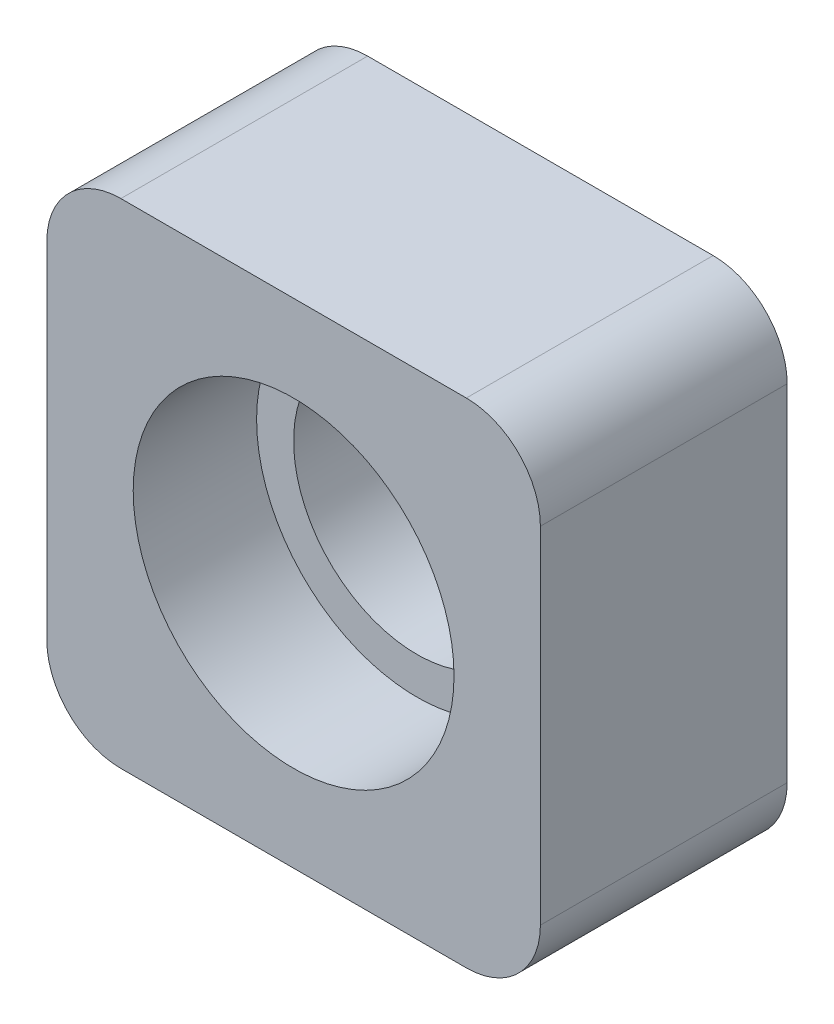
ISO-10303-21;
HEADER;
FILE_DESCRIPTION(('STEP AP214'),'2;1');
FILE_NAME('part.step','',(''),(''),'','','');
FILE_SCHEMA(('AUTOMOTIVE_DESIGN { 1 0 10303 214 1 1 1 1 }'));
ENDSEC;
DATA;
#1=APPLICATION_CONTEXT('core data for automotive mechanical design processes');
#2=APPLICATION_PROTOCOL_DEFINITION('international standard','automotive_design',2000,#1);
#3=PRODUCT_CONTEXT('',#1,'mechanical');
#4=PRODUCT('Part','Part','',(#3));
#5=PRODUCT_RELATED_PRODUCT_CATEGORY('part','',(#4));
#6=PRODUCT_DEFINITION_FORMATION('','',#4);
#7=PRODUCT_DEFINITION_CONTEXT('part definition',#1,'design');
#8=PRODUCT_DEFINITION('design','',#6,#7);
#9=PRODUCT_DEFINITION_SHAPE('','',#8);
#10=(LENGTH_UNIT() NAMED_UNIT(*) SI_UNIT(.MILLI.,.METRE.));
#11=(NAMED_UNIT(*) PLANE_ANGLE_UNIT() SI_UNIT($,.RADIAN.));
#12=(NAMED_UNIT(*) SI_UNIT($,.STERADIAN.) SOLID_ANGLE_UNIT());
#13=UNCERTAINTY_MEASURE_WITH_UNIT(LENGTH_MEASURE(1.E-05),#10,'distance_accuracy_value','');
#14=(GEOMETRIC_REPRESENTATION_CONTEXT(3) GLOBAL_UNCERTAINTY_ASSIGNED_CONTEXT((#13)) GLOBAL_UNIT_ASSIGNED_CONTEXT((#10,
#11,#12)) REPRESENTATION_CONTEXT('',''));
#15=CARTESIAN_POINT('',(0.,0.,0.));
#16=DIRECTION('',(0.,0.,1.));
#17=DIRECTION('',(1.,0.,0.));
#18=AXIS2_PLACEMENT_3D('',#15,#16,#17);
#19=CARTESIAN_POINT('',(0.,0.,-5.001));
#20=DIRECTION('',(0.,0.,1.));
#21=DIRECTION('',(1.,0.,0.));
#22=AXIS2_PLACEMENT_3D('',#19,#20,#21);
#23=CYLINDRICAL_SURFACE('',#22,5.);
#24=CARTESIAN_POINT('',(0.,0.,-5.));
#25=DIRECTION('',(0.,0.,-1.));
#26=DIRECTION('',(-1.,0.,0.));
#27=AXIS2_PLACEMENT_3D('',#24,#25,#26);
#28=CIRCLE('',#27,5.);
#29=CARTESIAN_POINT('',(-5.,0.,-5.));
#30=VERTEX_POINT('',#29);
#31=EDGE_CURVE('E208',#30,#30,#28,.F.);
#32=ORIENTED_EDGE('',*,*,#31,.F.);
#33=EDGE_LOOP('',(#32));
#34=FACE_BOUND('',#33,.T.);
#35=CARTESIAN_POINT('',(0.,0.,0.));
#36=DIRECTION('',(0.,0.,1.));
#37=DIRECTION('',(1.,0.,0.));
#38=AXIS2_PLACEMENT_3D('',#35,#36,#37);
#39=CIRCLE('',#38,5.);
#40=CARTESIAN_POINT('',(5.,0.,0.));
#41=VERTEX_POINT('',#40);
#42=EDGE_CURVE('E60',#41,#41,#39,.F.);
#43=ORIENTED_EDGE('',*,*,#42,.F.);
#44=EDGE_LOOP('',(#43));
#45=FACE_BOUND('',#44,.T.);
#46=ADVANCED_FACE('F56',(#34,#45),#23,.F.);
#47=CARTESIAN_POINT('',(10.,-10.,5.));
#48=DIRECTION('',(-1.,0.,0.));
#49=DIRECTION('',(0.,0.,1.));
#50=AXIS2_PLACEMENT_3D('',#47,#48,#49);
#51=PLANE('',#50);
#52=DIRECTION('',(0.,1.,0.));
#53=VECTOR('',#52,1.);
#54=CARTESIAN_POINT('',(10.,-10.,5.));
#55=LINE('',#54,#53);
#56=CARTESIAN_POINT('',(10.,-7.,5.));
#57=VERTEX_POINT('',#56);
#58=CARTESIAN_POINT('',(10.,7.,5.));
#59=VERTEX_POINT('',#58);
#60=EDGE_CURVE('E152',#57,#59,#55,.T.);
#61=ORIENTED_EDGE('',*,*,#60,.F.);
#62=DIRECTION('',(0.,0.,-1.));
#63=VECTOR('',#62,1.);
#64=CARTESIAN_POINT('',(10.,-7.,5.));
#65=LINE('',#64,#63);
#66=CARTESIAN_POINT('',(10.,-7.,-4.99999999999999));
#67=VERTEX_POINT('',#66);
#68=EDGE_CURVE('E192',#57,#67,#65,.T.);
#69=ORIENTED_EDGE('',*,*,#68,.T.);
#70=DIRECTION('',(0.,1.,0.));
#71=VECTOR('',#70,1.);
#72=CARTESIAN_POINT('',(10.,-10.,-4.99999999999999));
#73=LINE('',#72,#71);
#74=CARTESIAN_POINT('',(10.,7.,-4.99999999999999));
#75=VERTEX_POINT('',#74);
#76=EDGE_CURVE('E205',#67,#75,#73,.T.);
#77=ORIENTED_EDGE('',*,*,#76,.T.);
#78=DIRECTION('',(0.,0.,-1.));
#79=VECTOR('',#78,1.);
#80=CARTESIAN_POINT('',(10.,7.,5.));
#81=LINE('',#80,#79);
#82=EDGE_CURVE('E189',#75,#59,#81,.F.);
#83=ORIENTED_EDGE('',*,*,#82,.T.);
#84=EDGE_LOOP('',(#61,#69,#77,#83));
#85=FACE_BOUND('',#84,.T.);
#86=ADVANCED_FACE('F240',(#85),#51,.F.);
#87=CARTESIAN_POINT('',(-10.,9.99999999999999,5.));
#88=DIRECTION('',(0.,-1.,0.));
#89=DIRECTION('',(0.,0.,-1.));
#90=AXIS2_PLACEMENT_3D('',#87,#88,#89);
#91=PLANE('',#90);
#92=DIRECTION('',(-1.,0.,0.));
#93=VECTOR('',#92,1.);
#94=CARTESIAN_POINT('',(-10.,9.99999999999999,-5.));
#95=LINE('',#94,#93);
#96=CARTESIAN_POINT('',(7.,9.99999999999999,-5.));
#97=VERTEX_POINT('',#96);
#98=CARTESIAN_POINT('',(-7.,9.99999999999999,-5.));
#99=VERTEX_POINT('',#98);
#100=EDGE_CURVE('E160',#97,#99,#95,.T.);
#101=ORIENTED_EDGE('',*,*,#100,.T.);
#102=DIRECTION('',(0.,0.,-1.));
#103=VECTOR('',#102,1.);
#104=CARTESIAN_POINT('',(-7.,9.99999999999999,5.));
#105=LINE('',#104,#103);
#106=CARTESIAN_POINT('',(-7.,9.99999999999999,5.));
#107=VERTEX_POINT('',#106);
#108=EDGE_CURVE('E13',#99,#107,#105,.F.);
#109=ORIENTED_EDGE('',*,*,#108,.T.);
#110=DIRECTION('',(-1.,0.,0.));
#111=VECTOR('',#110,1.);
#112=CARTESIAN_POINT('',(-10.,9.99999999999999,5.));
#113=LINE('',#112,#111);
#114=CARTESIAN_POINT('',(7.,9.99999999999999,5.));
#115=VERTEX_POINT('',#114);
#116=EDGE_CURVE('E158',#115,#107,#113,.T.);
#117=ORIENTED_EDGE('',*,*,#116,.F.);
#118=DIRECTION('',(0.,0.,-1.));
#119=VECTOR('',#118,1.);
#120=CARTESIAN_POINT('',(7.,9.99999999999999,5.));
#121=LINE('',#120,#119);
#122=EDGE_CURVE('E66',#115,#97,#121,.T.);
#123=ORIENTED_EDGE('',*,*,#122,.T.);
#124=EDGE_LOOP('',(#101,#109,#117,#123));
#125=FACE_BOUND('',#124,.T.);
#126=ADVANCED_FACE('F201',(#125),#91,.F.);
#127=CARTESIAN_POINT('',(-10.,-10.,5.));
#128=DIRECTION('',(1.,0.,0.));
#129=DIRECTION('',(0.,0.,-1.));
#130=AXIS2_PLACEMENT_3D('',#127,#128,#129);
#131=PLANE('',#130);
#132=DIRECTION('',(0.,-1.,0.));
#133=VECTOR('',#132,1.);
#134=CARTESIAN_POINT('',(-10.,-10.,-5.));
#135=LINE('',#134,#133);
#136=CARTESIAN_POINT('',(-10.,7.,-5.));
#137=VERTEX_POINT('',#136);
#138=CARTESIAN_POINT('',(-10.,-7.,-5.));
#139=VERTEX_POINT('',#138);
#140=EDGE_CURVE('E153',#137,#139,#135,.T.);
#141=ORIENTED_EDGE('',*,*,#140,.T.);
#142=DIRECTION('',(0.,0.,-1.));
#143=VECTOR('',#142,1.);
#144=CARTESIAN_POINT('',(-10.,-7.,5.));
#145=LINE('',#144,#143);
#146=CARTESIAN_POINT('',(-10.,-7.,5.));
#147=VERTEX_POINT('',#146);
#148=EDGE_CURVE('E128',#139,#147,#145,.F.);
#149=ORIENTED_EDGE('',*,*,#148,.T.);
#150=DIRECTION('',(0.,-1.,0.));
#151=VECTOR('',#150,1.);
#152=CARTESIAN_POINT('',(-10.,-10.,5.));
#153=LINE('',#152,#151);
#154=CARTESIAN_POINT('',(-10.,7.,5.));
#155=VERTEX_POINT('',#154);
#156=EDGE_CURVE('E213',#155,#147,#153,.T.);
#157=ORIENTED_EDGE('',*,*,#156,.F.);
#158=DIRECTION('',(0.,0.,-1.));
#159=VECTOR('',#158,1.);
#160=CARTESIAN_POINT('',(-10.,7.,5.));
#161=LINE('',#160,#159);
#162=EDGE_CURVE('E134',#155,#137,#161,.T.);
#163=ORIENTED_EDGE('',*,*,#162,.T.);
#164=EDGE_LOOP('',(#141,#149,#157,#163));
#165=FACE_BOUND('',#164,.T.);
#166=ADVANCED_FACE('F264',(#165),#131,.F.);
#167=CARTESIAN_POINT('',(-10.,-10.,5.));
#168=DIRECTION('',(0.,1.,0.));
#169=DIRECTION('',(0.,0.,1.));
#170=AXIS2_PLACEMENT_3D('',#167,#168,#169);
#171=PLANE('',#170);
#172=DIRECTION('',(1.,0.,0.));
#173=VECTOR('',#172,1.);
#174=CARTESIAN_POINT('',(-10.,-10.,5.));
#175=LINE('',#174,#173);
#176=CARTESIAN_POINT('',(-7.,-10.,5.));
#177=VERTEX_POINT('',#176);
#178=CARTESIAN_POINT('',(7.,-10.,5.));
#179=VERTEX_POINT('',#178);
#180=EDGE_CURVE('E144',#177,#179,#175,.T.);
#181=ORIENTED_EDGE('',*,*,#180,.F.);
#182=DIRECTION('',(0.,0.,-1.));
#183=VECTOR('',#182,1.);
#184=CARTESIAN_POINT('',(-7.,-10.,5.));
#185=LINE('',#184,#183);
#186=CARTESIAN_POINT('',(-7.,-10.,-5.));
#187=VERTEX_POINT('',#186);
#188=EDGE_CURVE('E127',#177,#187,#185,.T.);
#189=ORIENTED_EDGE('',*,*,#188,.T.);
#190=DIRECTION('',(1.,0.,0.));
#191=VECTOR('',#190,1.);
#192=CARTESIAN_POINT('',(-10.,-10.,-5.));
#193=LINE('',#192,#191);
#194=CARTESIAN_POINT('',(7.,-10.,-5.));
#195=VERTEX_POINT('',#194);
#196=EDGE_CURVE('E141',#187,#195,#193,.T.);
#197=ORIENTED_EDGE('',*,*,#196,.T.);
#198=DIRECTION('',(0.,0.,-1.));
#199=VECTOR('',#198,1.);
#200=CARTESIAN_POINT('',(7.,-10.,5.));
#201=LINE('',#200,#199);
#202=EDGE_CURVE('E147',#195,#179,#201,.F.);
#203=ORIENTED_EDGE('',*,*,#202,.T.);
#204=EDGE_LOOP('',(#181,#189,#197,#203));
#205=FACE_BOUND('',#204,.T.);
#206=ADVANCED_FACE('F140',(#205),#171,.F.);
#207=CARTESIAN_POINT('',(0.,0.,5.));
#208=DIRECTION('',(0.,0.,-1.));
#209=DIRECTION('',(-1.,0.,0.));
#210=AXIS2_PLACEMENT_3D('',#207,#208,#209);
#211=PLANE('',#210);
#212=CARTESIAN_POINT('',(0.,0.,5.));
#213=DIRECTION('',(0.,0.,1.));
#214=DIRECTION('',(1.,0.,0.));
#215=AXIS2_PLACEMENT_3D('',#212,#213,#214);
#216=CIRCLE('',#215,6.5);
#217=CARTESIAN_POINT('',(6.5,0.,5.));
#218=VERTEX_POINT('',#217);
#219=EDGE_CURVE('E222',#218,#218,#216,.T.);
#220=ORIENTED_EDGE('',*,*,#219,.F.);
#221=EDGE_LOOP('',(#220));
#222=FACE_BOUND('',#221,.T.);
#223=ORIENTED_EDGE('',*,*,#156,.T.);
#224=CARTESIAN_POINT('',(-7.,-7.,5.));
#225=DIRECTION('',(0.,0.,-1.));
#226=DIRECTION('',(-1.,0.,0.));
#227=AXIS2_PLACEMENT_3D('',#224,#225,#226);
#228=CIRCLE('',#227,3.);
#229=EDGE_CURVE('E186',#147,#177,#228,.F.);
#230=ORIENTED_EDGE('',*,*,#229,.T.);
#231=ORIENTED_EDGE('',*,*,#180,.T.);
#232=CARTESIAN_POINT('',(7.,-7.,5.));
#233=DIRECTION('',(0.,0.,-1.));
#234=DIRECTION('',(-1.,0.,0.));
#235=AXIS2_PLACEMENT_3D('',#232,#233,#234);
#236=CIRCLE('',#235,3.);
#237=EDGE_CURVE('E183',#179,#57,#236,.F.);
#238=ORIENTED_EDGE('',*,*,#237,.T.);
#239=ORIENTED_EDGE('',*,*,#60,.T.);
#240=CARTESIAN_POINT('',(7.,7.,5.));
#241=DIRECTION('',(0.,0.,-1.));
#242=DIRECTION('',(-1.,0.,0.));
#243=AXIS2_PLACEMENT_3D('',#240,#241,#242);
#244=CIRCLE('',#243,3.);
#245=EDGE_CURVE('E78',#59,#115,#244,.F.);
#246=ORIENTED_EDGE('',*,*,#245,.T.);
#247=ORIENTED_EDGE('',*,*,#116,.T.);
#248=CARTESIAN_POINT('',(-7.,7.,5.));
#249=DIRECTION('',(0.,0.,-1.));
#250=DIRECTION('',(-1.,0.,0.));
#251=AXIS2_PLACEMENT_3D('',#248,#249,#250);
#252=CIRCLE('',#251,3.);
#253=EDGE_CURVE('E180',#107,#155,#252,.F.);
#254=ORIENTED_EDGE('',*,*,#253,.T.);
#255=EDGE_LOOP('',(#223,#230,#231,#238,#239,#246,#247,#254));
#256=FACE_BOUND('',#255,.T.);
#257=ADVANCED_FACE('F255',(#222,#256),#211,.F.);
#258=CARTESIAN_POINT('',(0.,0.,-5.));
#259=DIRECTION('',(0.,0.,-1.));
#260=DIRECTION('',(-1.,0.,0.));
#261=AXIS2_PLACEMENT_3D('',#258,#259,#260);
#262=PLANE('',#261);
#263=ORIENTED_EDGE('',*,*,#31,.T.);
#264=EDGE_LOOP('',(#263));
#265=FACE_BOUND('',#264,.T.);
#266=ORIENTED_EDGE('',*,*,#196,.F.);
#267=CARTESIAN_POINT('',(-7.,-7.,-5.));
#268=DIRECTION('',(0.,0.,-1.));
#269=DIRECTION('',(-1.,0.,0.));
#270=AXIS2_PLACEMENT_3D('',#267,#268,#269);
#271=CIRCLE('',#270,3.);
#272=EDGE_CURVE('E123',#187,#139,#271,.T.);
#273=ORIENTED_EDGE('',*,*,#272,.T.);
#274=ORIENTED_EDGE('',*,*,#140,.F.);
#275=CARTESIAN_POINT('',(-7.,7.,-5.));
#276=DIRECTION('',(0.,0.,-1.));
#277=DIRECTION('',(-1.,0.,0.));
#278=AXIS2_PLACEMENT_3D('',#275,#276,#277);
#279=CIRCLE('',#278,3.);
#280=EDGE_CURVE('E168',#137,#99,#279,.T.);
#281=ORIENTED_EDGE('',*,*,#280,.T.);
#282=ORIENTED_EDGE('',*,*,#100,.F.);
#283=CARTESIAN_POINT('',(7.,7.,-5.));
#284=DIRECTION('',(0.,0.,-1.));
#285=DIRECTION('',(-1.,0.,0.));
#286=AXIS2_PLACEMENT_3D('',#283,#284,#285);
#287=CIRCLE('',#286,3.);
#288=EDGE_CURVE('E146',#97,#75,#287,.T.);
#289=ORIENTED_EDGE('',*,*,#288,.T.);
#290=ORIENTED_EDGE('',*,*,#76,.F.);
#291=CARTESIAN_POINT('',(7.,-7.,-5.));
#292=DIRECTION('',(0.,0.,-1.));
#293=DIRECTION('',(-1.,0.,0.));
#294=AXIS2_PLACEMENT_3D('',#291,#292,#293);
#295=CIRCLE('',#294,3.);
#296=EDGE_CURVE('E135',#67,#195,#295,.T.);
#297=ORIENTED_EDGE('',*,*,#296,.T.);
#298=EDGE_LOOP('',(#266,#273,#274,#281,#282,#289,#290,#297));
#299=FACE_BOUND('',#298,.T.);
#300=ADVANCED_FACE('F149',(#265,#299),#262,.T.);
#301=CARTESIAN_POINT('',(-7.,-7.,5.));
#302=DIRECTION('',(0.,0.,-1.));
#303=DIRECTION('',(-1.,0.,0.));
#304=AXIS2_PLACEMENT_3D('',#301,#302,#303);
#305=CYLINDRICAL_SURFACE('',#304,3.);
#306=ORIENTED_EDGE('',*,*,#229,.F.);
#307=ORIENTED_EDGE('',*,*,#148,.F.);
#308=ORIENTED_EDGE('',*,*,#272,.F.);
#309=ORIENTED_EDGE('',*,*,#188,.F.);
#310=EDGE_LOOP('',(#306,#307,#308,#309));
#311=FACE_BOUND('',#310,.T.);
#312=ADVANCED_FACE('F126',(#311),#305,.T.);
#313=CARTESIAN_POINT('',(7.,-7.,5.));
#314=DIRECTION('',(0.,0.,-1.));
#315=DIRECTION('',(-1.,0.,0.));
#316=AXIS2_PLACEMENT_3D('',#313,#314,#315);
#317=CYLINDRICAL_SURFACE('',#316,3.);
#318=ORIENTED_EDGE('',*,*,#237,.F.);
#319=ORIENTED_EDGE('',*,*,#202,.F.);
#320=ORIENTED_EDGE('',*,*,#296,.F.);
#321=ORIENTED_EDGE('',*,*,#68,.F.);
#322=EDGE_LOOP('',(#318,#319,#320,#321));
#323=FACE_BOUND('',#322,.T.);
#324=ADVANCED_FACE('F272',(#323),#317,.T.);
#325=CARTESIAN_POINT('',(-7.,7.,5.));
#326=DIRECTION('',(0.,0.,-1.));
#327=DIRECTION('',(-1.,0.,0.));
#328=AXIS2_PLACEMENT_3D('',#325,#326,#327);
#329=CYLINDRICAL_SURFACE('',#328,3.);
#330=ORIENTED_EDGE('',*,*,#253,.F.);
#331=ORIENTED_EDGE('',*,*,#108,.F.);
#332=ORIENTED_EDGE('',*,*,#280,.F.);
#333=ORIENTED_EDGE('',*,*,#162,.F.);
#334=EDGE_LOOP('',(#330,#331,#332,#333));
#335=FACE_BOUND('',#334,.T.);
#336=ADVANCED_FACE('F274',(#335),#329,.T.);
#337=CARTESIAN_POINT('',(7.,7.,5.));
#338=DIRECTION('',(0.,0.,-1.));
#339=DIRECTION('',(-1.,0.,0.));
#340=AXIS2_PLACEMENT_3D('',#337,#338,#339);
#341=CYLINDRICAL_SURFACE('',#340,3.);
#342=ORIENTED_EDGE('',*,*,#245,.F.);
#343=ORIENTED_EDGE('',*,*,#82,.F.);
#344=ORIENTED_EDGE('',*,*,#288,.F.);
#345=ORIENTED_EDGE('',*,*,#122,.F.);
#346=EDGE_LOOP('',(#342,#343,#344,#345));
#347=FACE_BOUND('',#346,.T.);
#348=ADVANCED_FACE('F58',(#347),#341,.T.);
#349=CARTESIAN_POINT('',(0.,0.,0.));
#350=DIRECTION('',(0.,0.,1.));
#351=DIRECTION('',(1.,0.,0.));
#352=AXIS2_PLACEMENT_3D('',#349,#350,#351);
#353=PLANE('',#352);
#354=CARTESIAN_POINT('',(0.,0.,0.));
#355=DIRECTION('',(0.,0.,1.));
#356=DIRECTION('',(1.,0.,0.));
#357=AXIS2_PLACEMENT_3D('',#354,#355,#356);
#358=CIRCLE('',#357,6.5);
#359=CARTESIAN_POINT('',(6.5,0.,0.));
#360=VERTEX_POINT('',#359);
#361=EDGE_CURVE('E226',#360,#360,#358,.T.);
#362=ORIENTED_EDGE('',*,*,#361,.T.);
#363=EDGE_LOOP('',(#362));
#364=FACE_BOUND('',#363,.T.);
#365=ORIENTED_EDGE('',*,*,#42,.T.);
#366=EDGE_LOOP('',(#365));
#367=FACE_BOUND('',#366,.T.);
#368=ADVANCED_FACE('F237',(#364,#367),#353,.T.);
#369=CARTESIAN_POINT('',(0.,0.,0.));
#370=DIRECTION('',(0.,0.,1.));
#371=DIRECTION('',(1.,0.,0.));
#372=AXIS2_PLACEMENT_3D('',#369,#370,#371);
#373=CYLINDRICAL_SURFACE('',#372,6.5);
#374=ORIENTED_EDGE('',*,*,#361,.F.);
#375=EDGE_LOOP('',(#374));
#376=FACE_BOUND('',#375,.T.);
#377=ORIENTED_EDGE('',*,*,#219,.T.);
#378=EDGE_LOOP('',(#377));
#379=FACE_BOUND('',#378,.T.);
#380=ADVANCED_FACE('F253',(#376,#379),#373,.F.);
#381=CLOSED_SHELL('',(#46,#86,#126,#166,#206,#257,#300,#312,#324,#336,#348,#368,#380));
#382=MANIFOLD_SOLID_BREP('B2',#381);
#383=ADVANCED_BREP_SHAPE_REPRESENTATION('',(#18,#382),#14);
#384=SHAPE_DEFINITION_REPRESENTATION(#9,#383);
ENDSEC;
END-ISO-10303-21;
